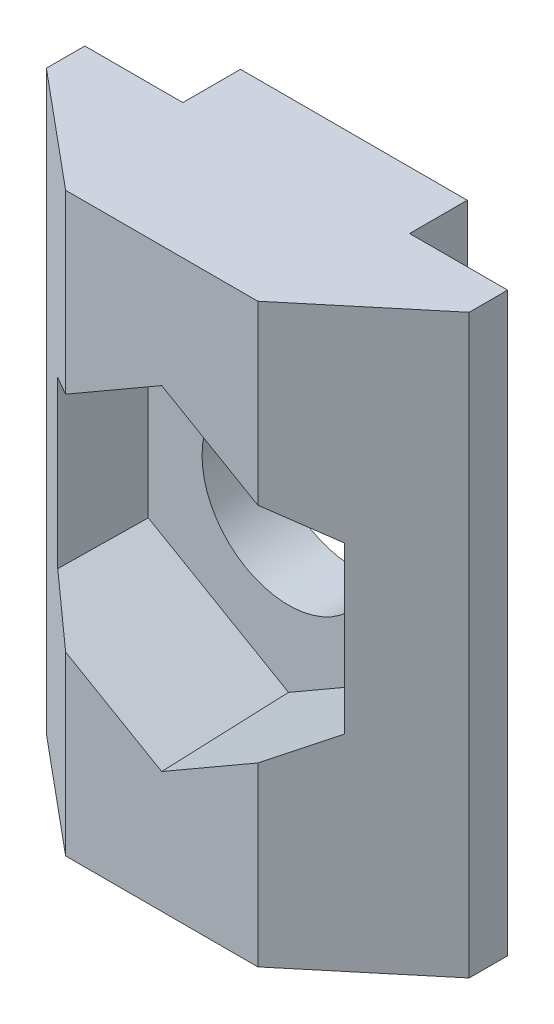
ISO-10303-21;
HEADER;
FILE_DESCRIPTION(('STEP AP214'),'2;1');
FILE_NAME('part.step','',(''),(''),'','','');
FILE_SCHEMA(('AUTOMOTIVE_DESIGN { 1 0 10303 214 1 1 1 1 }'));
ENDSEC;
DATA;
#1=APPLICATION_CONTEXT('core data for automotive mechanical design processes');
#2=APPLICATION_PROTOCOL_DEFINITION('international standard','automotive_design',2000,#1);
#3=PRODUCT_CONTEXT('',#1,'mechanical');
#4=PRODUCT('Part','Part','',(#3));
#5=PRODUCT_RELATED_PRODUCT_CATEGORY('part','',(#4));
#6=PRODUCT_DEFINITION_FORMATION('','',#4);
#7=PRODUCT_DEFINITION_CONTEXT('part definition',#1,'design');
#8=PRODUCT_DEFINITION('design','',#6,#7);
#9=PRODUCT_DEFINITION_SHAPE('','',#8);
#10=(LENGTH_UNIT() NAMED_UNIT(*) SI_UNIT(.MILLI.,.METRE.));
#11=(NAMED_UNIT(*) PLANE_ANGLE_UNIT() SI_UNIT($,.RADIAN.));
#12=(NAMED_UNIT(*) SI_UNIT($,.STERADIAN.) SOLID_ANGLE_UNIT());
#13=UNCERTAINTY_MEASURE_WITH_UNIT(LENGTH_MEASURE(1.E-05),#10,'distance_accuracy_value','');
#14=(GEOMETRIC_REPRESENTATION_CONTEXT(3) GLOBAL_UNCERTAINTY_ASSIGNED_CONTEXT((#13)) GLOBAL_UNIT_ASSIGNED_CONTEXT((#10,
#11,#12)) REPRESENTATION_CONTEXT('',''));
#15=CARTESIAN_POINT('',(0.,0.,0.));
#16=DIRECTION('',(0.,0.,1.));
#17=DIRECTION('',(1.,0.,0.));
#18=AXIS2_PLACEMENT_3D('',#15,#16,#17);
#19=CARTESIAN_POINT('',(-2.5,7.5,5.));
#20=DIRECTION('',(0.64018439966448,0.,-0.768221279597375));
#21=DIRECTION('',(-0.768221279597375,0.,-0.64018439966448));
#22=AXIS2_PLACEMENT_3D('',#19,#20,#21);
#23=PLANE('',#22);
#24=DIRECTION('',(0.695433201349024,0.424876858308782,0.579527667790854));
#25=VECTOR('',#24,1.);
#26=CARTESIAN_POINT('',(-1.14210653124241,3.73395610596564,6.13157789063133));
#27=LINE('',#26,#25);
#28=CARTESIAN_POINT('',(-2.5,2.90434729550825,5.));
#29=VERTEX_POINT('',#28);
#30=CARTESIAN_POINT('',(-3.72946045179254,2.15320499577449,3.97544962350621));
#31=VERTEX_POINT('',#30);
#32=EDGE_CURVE('E252',#29,#31,#27,.F.);
#33=ORIENTED_EDGE('',*,*,#32,.F.);
#34=DIRECTION('',(0.,-1.,0.));
#35=VECTOR('',#34,1.);
#36=CARTESIAN_POINT('',(-2.5,7.5,5.));
#37=LINE('',#36,#35);
#38=CARTESIAN_POINT('',(-2.5,7.5,5.));
#39=VERTEX_POINT('',#38);
#40=EDGE_CURVE('E187',#39,#29,#37,.T.);
#41=ORIENTED_EDGE('',*,*,#40,.F.);
#42=DIRECTION('',(0.768221279597376,0.,0.64018439966448));
#43=VECTOR('',#42,1.);
#44=CARTESIAN_POINT('',(-2.5,7.5,5.));
#45=LINE('',#44,#43);
#46=CARTESIAN_POINT('',(-5.5,7.5,2.5));
#47=VERTEX_POINT('',#46);
#48=EDGE_CURVE('E242',#47,#39,#45,.T.);
#49=ORIENTED_EDGE('',*,*,#48,.F.);
#50=DIRECTION('',(0.,-1.,0.));
#51=VECTOR('',#50,1.);
#52=CARTESIAN_POINT('',(-5.5,7.5,2.5));
#53=LINE('',#52,#51);
#54=CARTESIAN_POINT('',(-5.5,-7.5,2.5));
#55=VERTEX_POINT('',#54);
#56=EDGE_CURVE('E190',#47,#55,#53,.T.);
#57=ORIENTED_EDGE('',*,*,#56,.T.);
#58=DIRECTION('',(0.768221279597376,0.,0.64018439966448));
#59=VECTOR('',#58,1.);
#60=CARTESIAN_POINT('',(-2.5,-7.5,5.));
#61=LINE('',#60,#59);
#62=CARTESIAN_POINT('',(-2.5,-7.5,5.));
#63=VERTEX_POINT('',#62);
#64=EDGE_CURVE('E161',#55,#63,#61,.T.);
#65=ORIENTED_EDGE('',*,*,#64,.T.);
#66=CARTESIAN_POINT('',(-2.5,-2.90434729550824,5.));
#67=VERTEX_POINT('',#66);
#68=EDGE_CURVE('E186',#67,#63,#37,.T.);
#69=ORIENTED_EDGE('',*,*,#68,.F.);
#70=DIRECTION('',(-0.695433201349024,0.424876858308782,-0.579527667790854));
#71=VECTOR('',#70,1.);
#72=CARTESIAN_POINT('',(-5.57420863753429,-1.02615093507052,2.43815946872142));
#73=LINE('',#72,#71);
#74=CARTESIAN_POINT('',(-3.72946045179254,-2.15320499577449,3.97544962350621));
#75=VERTEX_POINT('',#74);
#76=EDGE_CURVE('E202',#75,#67,#73,.F.);
#77=ORIENTED_EDGE('',*,*,#76,.F.);
#78=DIRECTION('',(0.,1.,0.));
#79=VECTOR('',#78,1.);
#80=CARTESIAN_POINT('',(-3.72946045179254,7.5,3.97544962350621));
#81=LINE('',#80,#79);
#82=EDGE_CURVE('E11',#31,#75,#81,.F.);
#83=ORIENTED_EDGE('',*,*,#82,.F.);
#84=EDGE_LOOP('',(#33,#41,#49,#57,#65,#69,#77,#83));
#85=FACE_BOUND('',#84,.T.);
#86=ADVANCED_FACE('F32',(#85),#23,.F.);
#87=CARTESIAN_POINT('',(2.5,7.5,5.));
#88=DIRECTION('',(0.,0.,-1.));
#89=DIRECTION('',(-1.,0.,0.));
#90=AXIS2_PLACEMENT_3D('',#87,#88,#89);
#91=PLANE('',#90);
#92=DIRECTION('',(0.866025403784439,-0.5,0.));
#93=VECTOR('',#92,1.);
#94=CARTESIAN_POINT('',(3.70761926966138,2.20712798509066,5.));
#95=LINE('',#94,#93);
#96=CARTESIAN_POINT('',(2.5,2.90434729550824,5.));
#97=VERTEX_POINT('',#96);
#98=CARTESIAN_POINT('',(0.,4.34772296848231,5.));
#99=VERTEX_POINT('',#98);
#100=EDGE_CURVE('E216',#97,#99,#95,.F.);
#101=ORIENTED_EDGE('',*,*,#100,.F.);
#102=DIRECTION('',(0.,-1.,0.));
#103=VECTOR('',#102,1.);
#104=CARTESIAN_POINT('',(2.5,7.5,5.));
#105=LINE('',#104,#103);
#106=CARTESIAN_POINT('',(2.5,7.5,5.));
#107=VERTEX_POINT('',#106);
#108=EDGE_CURVE('E183',#107,#97,#105,.T.);
#109=ORIENTED_EDGE('',*,*,#108,.F.);
#110=DIRECTION('',(1.,0.,0.));
#111=VECTOR('',#110,1.);
#112=CARTESIAN_POINT('',(2.5,7.5,5.));
#113=LINE('',#112,#111);
#114=EDGE_CURVE('E240',#39,#107,#113,.T.);
#115=ORIENTED_EDGE('',*,*,#114,.F.);
#116=ORIENTED_EDGE('',*,*,#40,.T.);
#117=DIRECTION('',(0.866025403784439,0.5,0.));
#118=VECTOR('',#117,1.);
#119=CARTESIAN_POINT('',(-0.0576192696613839,4.3144564676328,5.));
#120=LINE('',#119,#118);
#121=EDGE_CURVE('E234',#99,#29,#120,.F.);
#122=ORIENTED_EDGE('',*,*,#121,.F.);
#123=EDGE_LOOP('',(#101,#109,#115,#116,#122));
#124=FACE_BOUND('',#123,.T.);
#125=ADVANCED_FACE('F230',(#124),#91,.F.);
#126=DIRECTION('',(-0.866025403784438,0.5,0.));
#127=VECTOR('',#126,1.);
#128=CARTESIAN_POINT('',(-3.70761926966138,-2.20712798509066,5.));
#129=LINE('',#128,#127);
#130=CARTESIAN_POINT('',(0.,-4.34772296848231,5.));
#131=VERTEX_POINT('',#130);
#132=EDGE_CURVE('E260',#67,#131,#129,.F.);
#133=ORIENTED_EDGE('',*,*,#132,.F.);
#134=ORIENTED_EDGE('',*,*,#68,.T.);
#135=DIRECTION('',(1.,0.,0.));
#136=VECTOR('',#135,1.);
#137=CARTESIAN_POINT('',(2.5,-7.5,5.));
#138=LINE('',#137,#136);
#139=CARTESIAN_POINT('',(2.5,-7.5,5.));
#140=VERTEX_POINT('',#139);
#141=EDGE_CURVE('E164',#63,#140,#138,.T.);
#142=ORIENTED_EDGE('',*,*,#141,.T.);
#143=CARTESIAN_POINT('',(2.5,-2.90434729550824,5.));
#144=VERTEX_POINT('',#143);
#145=EDGE_CURVE('E182',#144,#140,#105,.T.);
#146=ORIENTED_EDGE('',*,*,#145,.F.);
#147=DIRECTION('',(-0.866025403784439,-0.5,0.));
#148=VECTOR('',#147,1.);
#149=CARTESIAN_POINT('',(0.0576192696613834,-4.3144564676328,5.));
#150=LINE('',#149,#148);
#151=EDGE_CURVE('E257',#131,#144,#150,.F.);
#152=ORIENTED_EDGE('',*,*,#151,.F.);
#153=EDGE_LOOP('',(#133,#134,#142,#146,#152));
#154=FACE_BOUND('',#153,.T.);
#155=ADVANCED_FACE('F334',(#154),#91,.F.);
#156=CARTESIAN_POINT('',(5.5,7.5,2.5));
#157=DIRECTION('',(-0.64018439966448,0.,-0.768221279597376));
#158=DIRECTION('',(-0.768221279597376,0.,0.64018439966448));
#159=AXIS2_PLACEMENT_3D('',#156,#157,#158);
#160=PLANE('',#159);
#161=DIRECTION('',(0.695433201349024,-0.424876858308782,-0.579527667790854));
#162=VECTOR('',#161,1.);
#163=CARTESIAN_POINT('',(3.60054549706338,2.23196594772228,4.08287875244718));
#164=LINE('',#163,#162);
#165=CARTESIAN_POINT('',(3.72946045179254,2.15320499577449,3.97544962350621));
#166=VERTEX_POINT('',#165);
#167=EDGE_CURVE('E40',#166,#97,#164,.F.);
#168=ORIENTED_EDGE('',*,*,#167,.F.);
#169=DIRECTION('',(0.,-1.,0.));
#170=VECTOR('',#169,1.);
#171=CARTESIAN_POINT('',(3.72946045179254,7.5,3.97544962350621));
#172=LINE('',#171,#170);
#173=CARTESIAN_POINT('',(3.72946045179254,-2.15320499577449,3.97544962350621));
#174=VERTEX_POINT('',#173);
#175=EDGE_CURVE('E198',#174,#166,#172,.F.);
#176=ORIENTED_EDGE('',*,*,#175,.F.);
#177=DIRECTION('',(-0.695433201349024,-0.424876858308782,0.579527667790854));
#178=VECTOR('',#177,1.);
#179=CARTESIAN_POINT('',(8.03264760335527,0.475839223172837,0.389460330537277));
#180=LINE('',#179,#178);
#181=EDGE_CURVE('E205',#144,#174,#180,.F.);
#182=ORIENTED_EDGE('',*,*,#181,.F.);
#183=ORIENTED_EDGE('',*,*,#145,.T.);
#184=DIRECTION('',(0.768221279597376,0.,-0.64018439966448));
#185=VECTOR('',#184,1.);
#186=CARTESIAN_POINT('',(5.5,-7.5,2.5));
#187=LINE('',#186,#185);
#188=CARTESIAN_POINT('',(5.5,-7.5,2.5));
#189=VERTEX_POINT('',#188);
#190=EDGE_CURVE('E167',#140,#189,#187,.T.);
#191=ORIENTED_EDGE('',*,*,#190,.T.);
#192=DIRECTION('',(0.,-1.,0.));
#193=VECTOR('',#192,1.);
#194=CARTESIAN_POINT('',(5.5,7.5,2.5));
#195=LINE('',#194,#193);
#196=CARTESIAN_POINT('',(5.5,7.5,2.5));
#197=VERTEX_POINT('',#196);
#198=EDGE_CURVE('E179',#197,#189,#195,.T.);
#199=ORIENTED_EDGE('',*,*,#198,.F.);
#200=DIRECTION('',(0.768221279597376,0.,-0.64018439966448));
#201=VECTOR('',#200,1.);
#202=CARTESIAN_POINT('',(5.5,7.5,2.5));
#203=LINE('',#202,#201);
#204=EDGE_CURVE('E239',#107,#197,#203,.T.);
#205=ORIENTED_EDGE('',*,*,#204,.F.);
#206=ORIENTED_EDGE('',*,*,#108,.T.);
#207=EDGE_LOOP('',(#168,#176,#182,#183,#191,#199,#205,#206));
#208=FACE_BOUND('',#207,.T.);
#209=ADVANCED_FACE('F237',(#208),#160,.F.);
#210=CARTESIAN_POINT('',(0.,0.,0.));
#211=DIRECTION('',(0.,0.,1.));
#212=DIRECTION('',(1.,0.,0.));
#213=AXIS2_PLACEMENT_3D('',#210,#211,#212);
#214=CYLINDRICAL_SURFACE('',#213,2.25);
#215=CARTESIAN_POINT('',(0.,0.,0.));
#216=DIRECTION('',(0.,0.,1.));
#217=DIRECTION('',(1.,0.,0.));
#218=AXIS2_PLACEMENT_3D('',#215,#216,#217);
#219=CIRCLE('',#218,2.25);
#220=CARTESIAN_POINT('',(2.25,0.,0.));
#221=VERTEX_POINT('',#220);
#222=EDGE_CURVE('E157',#221,#221,#219,.T.);
#223=ORIENTED_EDGE('',*,*,#222,.F.);
#224=EDGE_LOOP('',(#223));
#225=FACE_BOUND('',#224,.T.);
#226=CARTESIAN_POINT('',(0.,0.,1.7));
#227=DIRECTION('',(0.,0.,1.));
#228=DIRECTION('',(1.,0.,0.));
#229=AXIS2_PLACEMENT_3D('',#226,#227,#228);
#230=CIRCLE('',#229,2.25);
#231=CARTESIAN_POINT('',(2.25,0.,1.7));
#232=VERTEX_POINT('',#231);
#233=EDGE_CURVE('E199',#232,#232,#230,.F.);
#234=ORIENTED_EDGE('',*,*,#233,.F.);
#235=EDGE_LOOP('',(#234));
#236=FACE_BOUND('',#235,.T.);
#237=ADVANCED_FACE('F367',(#225,#236),#214,.F.);
#238=CARTESIAN_POINT('',(-2.95,7.5,1.5));
#239=DIRECTION('',(1.,0.,0.));
#240=DIRECTION('',(0.,0.,-1.));
#241=AXIS2_PLACEMENT_3D('',#238,#239,#240);
#242=PLANE('',#241);
#243=DIRECTION('',(0.,0.,1.));
#244=VECTOR('',#243,1.);
#245=CARTESIAN_POINT('',(-2.95,-7.5,1.5));
#246=LINE('',#245,#244);
#247=CARTESIAN_POINT('',(-2.95,-7.5,0.));
#248=VERTEX_POINT('',#247);
#249=CARTESIAN_POINT('',(-2.95,-7.5,1.5));
#250=VERTEX_POINT('',#249);
#251=EDGE_CURVE('E153',#248,#250,#246,.T.);
#252=ORIENTED_EDGE('',*,*,#251,.T.);
#253=DIRECTION('',(0.,-1.,0.));
#254=VECTOR('',#253,1.);
#255=CARTESIAN_POINT('',(-2.95,7.5,1.5));
#256=LINE('',#255,#254);
#257=CARTESIAN_POINT('',(-2.95,7.5,1.5));
#258=VERTEX_POINT('',#257);
#259=EDGE_CURVE('E196',#258,#250,#256,.T.);
#260=ORIENTED_EDGE('',*,*,#259,.F.);
#261=DIRECTION('',(0.,0.,1.));
#262=VECTOR('',#261,1.);
#263=CARTESIAN_POINT('',(-2.95,7.5,1.5));
#264=LINE('',#263,#262);
#265=CARTESIAN_POINT('',(-2.95,7.5,0.));
#266=VERTEX_POINT('',#265);
#267=EDGE_CURVE('E175',#266,#258,#264,.T.);
#268=ORIENTED_EDGE('',*,*,#267,.F.);
#269=DIRECTION('',(0.,-1.,0.));
#270=VECTOR('',#269,1.);
#271=CARTESIAN_POINT('',(-2.95,7.5,0.));
#272=LINE('',#271,#270);
#273=EDGE_CURVE('E149',#266,#248,#272,.T.);
#274=ORIENTED_EDGE('',*,*,#273,.T.);
#275=EDGE_LOOP('',(#252,#260,#268,#274));
#276=FACE_BOUND('',#275,.T.);
#277=ADVANCED_FACE('F34',(#276),#242,.F.);
#278=CARTESIAN_POINT('',(-5.5,7.5,1.5));
#279=DIRECTION('',(0.,0.,1.));
#280=DIRECTION('',(1.,0.,0.));
#281=AXIS2_PLACEMENT_3D('',#278,#279,#280);
#282=PLANE('',#281);
#283=DIRECTION('',(-1.,0.,0.));
#284=VECTOR('',#283,1.);
#285=CARTESIAN_POINT('',(-5.5,-7.5,1.5));
#286=LINE('',#285,#284);
#287=CARTESIAN_POINT('',(-5.5,-7.5,1.5));
#288=VERTEX_POINT('',#287);
#289=EDGE_CURVE('E156',#250,#288,#286,.T.);
#290=ORIENTED_EDGE('',*,*,#289,.T.);
#291=DIRECTION('',(0.,-1.,0.));
#292=VECTOR('',#291,1.);
#293=CARTESIAN_POINT('',(-5.5,7.5,1.5));
#294=LINE('',#293,#292);
#295=CARTESIAN_POINT('',(-5.5,7.5,1.5));
#296=VERTEX_POINT('',#295);
#297=EDGE_CURVE('E193',#296,#288,#294,.T.);
#298=ORIENTED_EDGE('',*,*,#297,.F.);
#299=DIRECTION('',(-1.,0.,0.));
#300=VECTOR('',#299,1.);
#301=CARTESIAN_POINT('',(-5.5,7.5,1.5));
#302=LINE('',#301,#300);
#303=EDGE_CURVE('E104',#258,#296,#302,.T.);
#304=ORIENTED_EDGE('',*,*,#303,.F.);
#305=ORIENTED_EDGE('',*,*,#259,.T.);
#306=EDGE_LOOP('',(#290,#298,#304,#305));
#307=FACE_BOUND('',#306,.T.);
#308=ADVANCED_FACE('F361',(#307),#282,.F.);
#309=CARTESIAN_POINT('',(-5.5,7.5,2.5));
#310=DIRECTION('',(1.,0.,0.));
#311=DIRECTION('',(0.,0.,-1.));
#312=AXIS2_PLACEMENT_3D('',#309,#310,#311);
#313=PLANE('',#312);
#314=DIRECTION('',(0.,0.,1.));
#315=VECTOR('',#314,1.);
#316=CARTESIAN_POINT('',(-5.5,-7.5,2.5));
#317=LINE('',#316,#315);
#318=EDGE_CURVE('E159',#288,#55,#317,.T.);
#319=ORIENTED_EDGE('',*,*,#318,.T.);
#320=ORIENTED_EDGE('',*,*,#56,.F.);
#321=DIRECTION('',(0.,0.,1.));
#322=VECTOR('',#321,1.);
#323=CARTESIAN_POINT('',(-5.5,7.5,2.5));
#324=LINE('',#323,#322);
#325=EDGE_CURVE('E246',#296,#47,#324,.T.);
#326=ORIENTED_EDGE('',*,*,#325,.F.);
#327=ORIENTED_EDGE('',*,*,#297,.T.);
#328=EDGE_LOOP('',(#319,#320,#326,#327));
#329=FACE_BOUND('',#328,.T.);
#330=ADVANCED_FACE('F358',(#329),#313,.F.);
#331=CARTESIAN_POINT('',(5.5,7.5,1.5));
#332=DIRECTION('',(-1.,0.,0.));
#333=DIRECTION('',(0.,0.,1.));
#334=AXIS2_PLACEMENT_3D('',#331,#332,#333);
#335=PLANE('',#334);
#336=DIRECTION('',(0.,0.,-1.));
#337=VECTOR('',#336,1.);
#338=CARTESIAN_POINT('',(5.5,-7.5,1.5));
#339=LINE('',#338,#337);
#340=CARTESIAN_POINT('',(5.5,-7.5,1.5));
#341=VERTEX_POINT('',#340);
#342=EDGE_CURVE('E169',#189,#341,#339,.T.);
#343=ORIENTED_EDGE('',*,*,#342,.T.);
#344=DIRECTION('',(0.,-1.,0.));
#345=VECTOR('',#344,1.);
#346=CARTESIAN_POINT('',(5.5,7.5,1.5));
#347=LINE('',#346,#345);
#348=CARTESIAN_POINT('',(5.5,7.5,1.5));
#349=VERTEX_POINT('',#348);
#350=EDGE_CURVE('E144',#349,#341,#347,.T.);
#351=ORIENTED_EDGE('',*,*,#350,.F.);
#352=DIRECTION('',(0.,0.,-1.));
#353=VECTOR('',#352,1.);
#354=CARTESIAN_POINT('',(5.5,7.5,1.5));
#355=LINE('',#354,#353);
#356=EDGE_CURVE('E132',#197,#349,#355,.T.);
#357=ORIENTED_EDGE('',*,*,#356,.F.);
#358=ORIENTED_EDGE('',*,*,#198,.T.);
#359=EDGE_LOOP('',(#343,#351,#357,#358));
#360=FACE_BOUND('',#359,.T.);
#361=ADVANCED_FACE('F360',(#360),#335,.F.);
#362=CARTESIAN_POINT('',(2.95,7.5,1.5));
#363=DIRECTION('',(0.,0.,1.));
#364=DIRECTION('',(1.,0.,0.));
#365=AXIS2_PLACEMENT_3D('',#362,#363,#364);
#366=PLANE('',#365);
#367=DIRECTION('',(-1.,0.,0.));
#368=VECTOR('',#367,1.);
#369=CARTESIAN_POINT('',(2.95,-7.5,1.5));
#370=LINE('',#369,#368);
#371=CARTESIAN_POINT('',(2.95,-7.5,1.5));
#372=VERTEX_POINT('',#371);
#373=EDGE_CURVE('E141',#341,#372,#370,.T.);
#374=ORIENTED_EDGE('',*,*,#373,.T.);
#375=DIRECTION('',(0.,-1.,0.));
#376=VECTOR('',#375,1.);
#377=CARTESIAN_POINT('',(2.95,7.5,1.5));
#378=LINE('',#377,#376);
#379=CARTESIAN_POINT('',(2.95,7.5,1.5));
#380=VERTEX_POINT('',#379);
#381=EDGE_CURVE('E138',#380,#372,#378,.T.);
#382=ORIENTED_EDGE('',*,*,#381,.F.);
#383=DIRECTION('',(-1.,0.,0.));
#384=VECTOR('',#383,1.);
#385=CARTESIAN_POINT('',(2.95,7.5,1.5));
#386=LINE('',#385,#384);
#387=EDGE_CURVE('E125',#349,#380,#386,.T.);
#388=ORIENTED_EDGE('',*,*,#387,.F.);
#389=ORIENTED_EDGE('',*,*,#350,.T.);
#390=EDGE_LOOP('',(#374,#382,#388,#389));
#391=FACE_BOUND('',#390,.T.);
#392=ADVANCED_FACE('F139',(#391),#366,.F.);
#393=CARTESIAN_POINT('',(2.95,7.5,0.));
#394=DIRECTION('',(-1.,0.,0.));
#395=DIRECTION('',(0.,0.,1.));
#396=AXIS2_PLACEMENT_3D('',#393,#394,#395);
#397=PLANE('',#396);
#398=DIRECTION('',(0.,0.,-1.));
#399=VECTOR('',#398,1.);
#400=CARTESIAN_POINT('',(2.95,-7.5,0.));
#401=LINE('',#400,#399);
#402=CARTESIAN_POINT('',(2.95,-7.5,0.));
#403=VERTEX_POINT('',#402);
#404=EDGE_CURVE('E172',#372,#403,#401,.T.);
#405=ORIENTED_EDGE('',*,*,#404,.T.);
#406=DIRECTION('',(0.,-1.,0.));
#407=VECTOR('',#406,1.);
#408=CARTESIAN_POINT('',(2.95,7.5,0.));
#409=LINE('',#408,#407);
#410=CARTESIAN_POINT('',(2.95,7.5,0.));
#411=VERTEX_POINT('',#410);
#412=EDGE_CURVE('E145',#411,#403,#409,.T.);
#413=ORIENTED_EDGE('',*,*,#412,.F.);
#414=DIRECTION('',(0.,0.,-1.));
#415=VECTOR('',#414,1.);
#416=CARTESIAN_POINT('',(2.95,7.5,0.));
#417=LINE('',#416,#415);
#418=EDGE_CURVE('E129',#380,#411,#417,.T.);
#419=ORIENTED_EDGE('',*,*,#418,.F.);
#420=ORIENTED_EDGE('',*,*,#381,.T.);
#421=EDGE_LOOP('',(#405,#413,#419,#420));
#422=FACE_BOUND('',#421,.T.);
#423=ADVANCED_FACE('F147',(#422),#397,.F.);
#424=CARTESIAN_POINT('',(-2.95,7.5,0.));
#425=DIRECTION('',(0.,0.,1.));
#426=DIRECTION('',(1.,0.,0.));
#427=AXIS2_PLACEMENT_3D('',#424,#425,#426);
#428=PLANE('',#427);
#429=ORIENTED_EDGE('',*,*,#222,.T.);
#430=EDGE_LOOP('',(#429));
#431=FACE_BOUND('',#430,.T.);
#432=DIRECTION('',(-1.,0.,0.));
#433=VECTOR('',#432,1.);
#434=CARTESIAN_POINT('',(-2.95,-7.5,0.));
#435=LINE('',#434,#433);
#436=EDGE_CURVE('E95',#403,#248,#435,.T.);
#437=ORIENTED_EDGE('',*,*,#436,.T.);
#438=ORIENTED_EDGE('',*,*,#273,.F.);
#439=DIRECTION('',(-1.,0.,0.));
#440=VECTOR('',#439,1.);
#441=CARTESIAN_POINT('',(-2.95,7.5,0.));
#442=LINE('',#441,#440);
#443=EDGE_CURVE('E56',#411,#266,#442,.T.);
#444=ORIENTED_EDGE('',*,*,#443,.F.);
#445=ORIENTED_EDGE('',*,*,#412,.T.);
#446=EDGE_LOOP('',(#437,#438,#444,#445));
#447=FACE_BOUND('',#446,.T.);
#448=ADVANCED_FACE('F382',(#431,#447),#428,.F.);
#449=CARTESIAN_POINT('',(0.,7.5,0.));
#450=DIRECTION('',(0.,-1.,0.));
#451=DIRECTION('',(0.,0.,-1.));
#452=AXIS2_PLACEMENT_3D('',#449,#450,#451);
#453=PLANE('',#452);
#454=ORIENTED_EDGE('',*,*,#267,.T.);
#455=ORIENTED_EDGE('',*,*,#303,.T.);
#456=ORIENTED_EDGE('',*,*,#325,.T.);
#457=ORIENTED_EDGE('',*,*,#48,.T.);
#458=ORIENTED_EDGE('',*,*,#114,.T.);
#459=ORIENTED_EDGE('',*,*,#204,.T.);
#460=ORIENTED_EDGE('',*,*,#356,.T.);
#461=ORIENTED_EDGE('',*,*,#387,.T.);
#462=ORIENTED_EDGE('',*,*,#418,.T.);
#463=ORIENTED_EDGE('',*,*,#443,.T.);
#464=EDGE_LOOP('',(#454,#455,#456,#457,#458,#459,#460,#461,#462,#463));
#465=FACE_BOUND('',#464,.T.);
#466=ADVANCED_FACE('F127',(#465),#453,.F.);
#467=CARTESIAN_POINT('',(0.,-7.5,0.));
#468=DIRECTION('',(0.,-1.,0.));
#469=DIRECTION('',(0.,0.,-1.));
#470=AXIS2_PLACEMENT_3D('',#467,#468,#469);
#471=PLANE('',#470);
#472=ORIENTED_EDGE('',*,*,#251,.F.);
#473=ORIENTED_EDGE('',*,*,#436,.F.);
#474=ORIENTED_EDGE('',*,*,#404,.F.);
#475=ORIENTED_EDGE('',*,*,#373,.F.);
#476=ORIENTED_EDGE('',*,*,#342,.F.);
#477=ORIENTED_EDGE('',*,*,#190,.F.);
#478=ORIENTED_EDGE('',*,*,#141,.F.);
#479=ORIENTED_EDGE('',*,*,#64,.F.);
#480=ORIENTED_EDGE('',*,*,#318,.F.);
#481=ORIENTED_EDGE('',*,*,#289,.F.);
#482=EDGE_LOOP('',(#472,#473,#474,#475,#476,#477,#478,#479,#480,#481));
#483=FACE_BOUND('',#482,.T.);
#484=ADVANCED_FACE('F376',(#483),#471,.T.);
#485=CARTESIAN_POINT('',(-3.65,2.10732848254214,1.7));
#486=DIRECTION('',(-0.999390827019096,0.,-0.034899496702501));
#487=DIRECTION('',(-0.034899496702501,0.,0.999390827019096));
#488=AXIS2_PLACEMENT_3D('',#485,#486,#487);
#489=PLANE('',#488);
#490=ORIENTED_EDGE('',*,*,#82,.T.);
#491=DIRECTION('',(0.0348924144072821,0.0201451448507203,-0.999188016619382));
#492=VECTOR('',#491,1.);
#493=CARTESIAN_POINT('',(-3.65,-2.10732848254213,1.7));
#494=LINE('',#493,#492);
#495=CARTESIAN_POINT('',(-3.65,-2.10732848254213,1.7));
#496=VERTEX_POINT('',#495);
#497=EDGE_CURVE('E267',#75,#496,#494,.T.);
#498=ORIENTED_EDGE('',*,*,#497,.T.);
#499=DIRECTION('',(0.,-1.,0.));
#500=VECTOR('',#499,1.);
#501=CARTESIAN_POINT('',(-3.65,2.10732848254214,1.7));
#502=LINE('',#501,#500);
#503=CARTESIAN_POINT('',(-3.65,2.10732848254214,1.7));
#504=VERTEX_POINT('',#503);
#505=EDGE_CURVE('E284',#504,#496,#502,.T.);
#506=ORIENTED_EDGE('',*,*,#505,.F.);
#507=DIRECTION('',(0.0348924144072821,-0.0201451448507203,-0.999188016619382));
#508=VECTOR('',#507,1.);
#509=CARTESIAN_POINT('',(-3.65,2.10732848254214,1.7));
#510=LINE('',#509,#508);
#511=EDGE_CURVE('E264',#31,#504,#510,.T.);
#512=ORIENTED_EDGE('',*,*,#511,.F.);
#513=EDGE_LOOP('',(#490,#498,#506,#512));
#514=FACE_BOUND('',#513,.T.);
#515=ADVANCED_FACE('F324',(#514),#489,.F.);
#516=CARTESIAN_POINT('',(0.,4.21465696508427,1.7));
#517=DIRECTION('',(-0.499695413509548,0.865497844507677,-0.034899496702501));
#518=DIRECTION('',(-0.866025403784439,-0.5,0.));
#519=AXIS2_PLACEMENT_3D('',#516,#517,#518);
#520=PLANE('',#519);
#521=ORIENTED_EDGE('',*,*,#32,.T.);
#522=ORIENTED_EDGE('',*,*,#511,.T.);
#523=DIRECTION('',(-0.866025403784439,-0.5,0.));
#524=VECTOR('',#523,1.);
#525=CARTESIAN_POINT('',(0.,4.21465696508427,1.7));
#526=LINE('',#525,#524);
#527=CARTESIAN_POINT('',(0.,4.21465696508427,1.7));
#528=VERTEX_POINT('',#527);
#529=EDGE_CURVE('E287',#528,#504,#526,.T.);
#530=ORIENTED_EDGE('',*,*,#529,.F.);
#531=DIRECTION('',(0.,-0.0402902897014406,-0.999188016619382));
#532=VECTOR('',#531,1.);
#533=CARTESIAN_POINT('',(0.,4.21465696508427,1.7));
#534=LINE('',#533,#532);
#535=EDGE_CURVE('E203',#99,#528,#534,.T.);
#536=ORIENTED_EDGE('',*,*,#535,.F.);
#537=ORIENTED_EDGE('',*,*,#121,.T.);
#538=EDGE_LOOP('',(#521,#522,#530,#536,#537));
#539=FACE_BOUND('',#538,.T.);
#540=ADVANCED_FACE('F321',(#539),#520,.F.);
#541=CARTESIAN_POINT('',(-3.65,-2.10732848254213,1.7));
#542=DIRECTION('',(-0.499695413509548,-0.865497844507676,-0.034899496702501));
#543=DIRECTION('',(0.866025403784438,-0.5,0.));
#544=AXIS2_PLACEMENT_3D('',#541,#542,#543);
#545=PLANE('',#544);
#546=ORIENTED_EDGE('',*,*,#76,.T.);
#547=ORIENTED_EDGE('',*,*,#132,.T.);
#548=DIRECTION('',(0.,0.0402902897014406,-0.999188016619382));
#549=VECTOR('',#548,1.);
#550=CARTESIAN_POINT('',(0.,-4.21465696508427,1.7));
#551=LINE('',#550,#549);
#552=CARTESIAN_POINT('',(0.,-4.21465696508427,1.7));
#553=VERTEX_POINT('',#552);
#554=EDGE_CURVE('E270',#131,#553,#551,.T.);
#555=ORIENTED_EDGE('',*,*,#554,.T.);
#556=DIRECTION('',(0.866025403784439,-0.5,0.));
#557=VECTOR('',#556,1.);
#558=CARTESIAN_POINT('',(-3.65,-2.10732848254213,1.7));
#559=LINE('',#558,#557);
#560=EDGE_CURVE('E281',#496,#553,#559,.T.);
#561=ORIENTED_EDGE('',*,*,#560,.F.);
#562=ORIENTED_EDGE('',*,*,#497,.F.);
#563=EDGE_LOOP('',(#546,#547,#555,#561,#562));
#564=FACE_BOUND('',#563,.T.);
#565=ADVANCED_FACE('F329',(#564),#545,.F.);
#566=CARTESIAN_POINT('',(3.65,2.10732848254214,1.7));
#567=DIRECTION('',(0.499695413509548,0.865497844507676,-0.034899496702501));
#568=DIRECTION('',(-0.866025403784439,0.5,0.));
#569=AXIS2_PLACEMENT_3D('',#566,#567,#568);
#570=PLANE('',#569);
#571=ORIENTED_EDGE('',*,*,#167,.T.);
#572=ORIENTED_EDGE('',*,*,#100,.T.);
#573=ORIENTED_EDGE('',*,*,#535,.T.);
#574=DIRECTION('',(-0.866025403784438,0.5,0.));
#575=VECTOR('',#574,1.);
#576=CARTESIAN_POINT('',(3.65,2.10732848254214,1.7));
#577=LINE('',#576,#575);
#578=CARTESIAN_POINT('',(3.65,2.10732848254214,1.7));
#579=VERTEX_POINT('',#578);
#580=EDGE_CURVE('E290',#579,#528,#577,.T.);
#581=ORIENTED_EDGE('',*,*,#580,.F.);
#582=DIRECTION('',(-0.0348924144072821,-0.0201451448507203,-0.999188016619382));
#583=VECTOR('',#582,1.);
#584=CARTESIAN_POINT('',(3.65,2.10732848254214,1.7));
#585=LINE('',#584,#583);
#586=EDGE_CURVE('E221',#166,#579,#585,.T.);
#587=ORIENTED_EDGE('',*,*,#586,.F.);
#588=EDGE_LOOP('',(#571,#572,#573,#581,#587));
#589=FACE_BOUND('',#588,.T.);
#590=ADVANCED_FACE('F213',(#589),#570,.F.);
#591=CARTESIAN_POINT('',(0.,-4.21465696508427,1.7));
#592=DIRECTION('',(0.499695413509548,-0.865497844507677,-0.034899496702501));
#593=DIRECTION('',(0.866025403784439,0.5,0.));
#594=AXIS2_PLACEMENT_3D('',#591,#592,#593);
#595=PLANE('',#594);
#596=ORIENTED_EDGE('',*,*,#181,.T.);
#597=DIRECTION('',(-0.0348924144072821,0.0201451448507203,-0.999188016619382));
#598=VECTOR('',#597,1.);
#599=CARTESIAN_POINT('',(3.65,-2.10732848254214,1.7));
#600=LINE('',#599,#598);
#601=CARTESIAN_POINT('',(3.65,-2.10732848254214,1.7));
#602=VERTEX_POINT('',#601);
#603=EDGE_CURVE('E47',#174,#602,#600,.T.);
#604=ORIENTED_EDGE('',*,*,#603,.T.);
#605=DIRECTION('',(0.866025403784439,0.5,0.));
#606=VECTOR('',#605,1.);
#607=CARTESIAN_POINT('',(0.,-4.21465696508427,1.7));
#608=LINE('',#607,#606);
#609=EDGE_CURVE('E278',#553,#602,#608,.T.);
#610=ORIENTED_EDGE('',*,*,#609,.F.);
#611=ORIENTED_EDGE('',*,*,#554,.F.);
#612=ORIENTED_EDGE('',*,*,#151,.T.);
#613=EDGE_LOOP('',(#596,#604,#610,#611,#612));
#614=FACE_BOUND('',#613,.T.);
#615=ADVANCED_FACE('F338',(#614),#595,.F.);
#616=CARTESIAN_POINT('',(3.65,-2.10732848254214,1.7));
#617=DIRECTION('',(0.999390827019096,0.,-0.034899496702501));
#618=DIRECTION('',(-0.034899496702501,0.,-0.999390827019096));
#619=AXIS2_PLACEMENT_3D('',#616,#617,#618);
#620=PLANE('',#619);
#621=ORIENTED_EDGE('',*,*,#175,.T.);
#622=ORIENTED_EDGE('',*,*,#586,.T.);
#623=DIRECTION('',(0.,1.,0.));
#624=VECTOR('',#623,1.);
#625=CARTESIAN_POINT('',(3.65,-2.10732848254214,1.7));
#626=LINE('',#625,#624);
#627=EDGE_CURVE('E235',#602,#579,#626,.T.);
#628=ORIENTED_EDGE('',*,*,#627,.F.);
#629=ORIENTED_EDGE('',*,*,#603,.F.);
#630=EDGE_LOOP('',(#621,#622,#628,#629));
#631=FACE_BOUND('',#630,.T.);
#632=ADVANCED_FACE('F340',(#631),#620,.F.);
#633=CARTESIAN_POINT('',(0.,0.,1.7));
#634=DIRECTION('',(0.,0.,1.));
#635=DIRECTION('',(1.,0.,0.));
#636=AXIS2_PLACEMENT_3D('',#633,#634,#635);
#637=PLANE('',#636);
#638=ORIENTED_EDGE('',*,*,#580,.T.);
#639=ORIENTED_EDGE('',*,*,#529,.T.);
#640=ORIENTED_EDGE('',*,*,#505,.T.);
#641=ORIENTED_EDGE('',*,*,#560,.T.);
#642=ORIENTED_EDGE('',*,*,#609,.T.);
#643=ORIENTED_EDGE('',*,*,#627,.T.);
#644=EDGE_LOOP('',(#638,#639,#640,#641,#642,#643));
#645=FACE_BOUND('',#644,.T.);
#646=ORIENTED_EDGE('',*,*,#233,.T.);
#647=EDGE_LOOP('',(#646));
#648=FACE_BOUND('',#647,.T.);
#649=ADVANCED_FACE('F294',(#645,#648),#637,.T.);
#650=CLOSED_SHELL('',(#86,#125,#155,#209,#237,#277,#308,#330,#361,#392,#423,#448,#466,#484,#515,
#540,#565,#590,#615,#632,#649));
#651=MANIFOLD_SOLID_BREP('B2',#650);
#652=ADVANCED_BREP_SHAPE_REPRESENTATION('',(#18,#651),#14);
#653=SHAPE_DEFINITION_REPRESENTATION(#9,#652);
ENDSEC;
END-ISO-10303-21;
